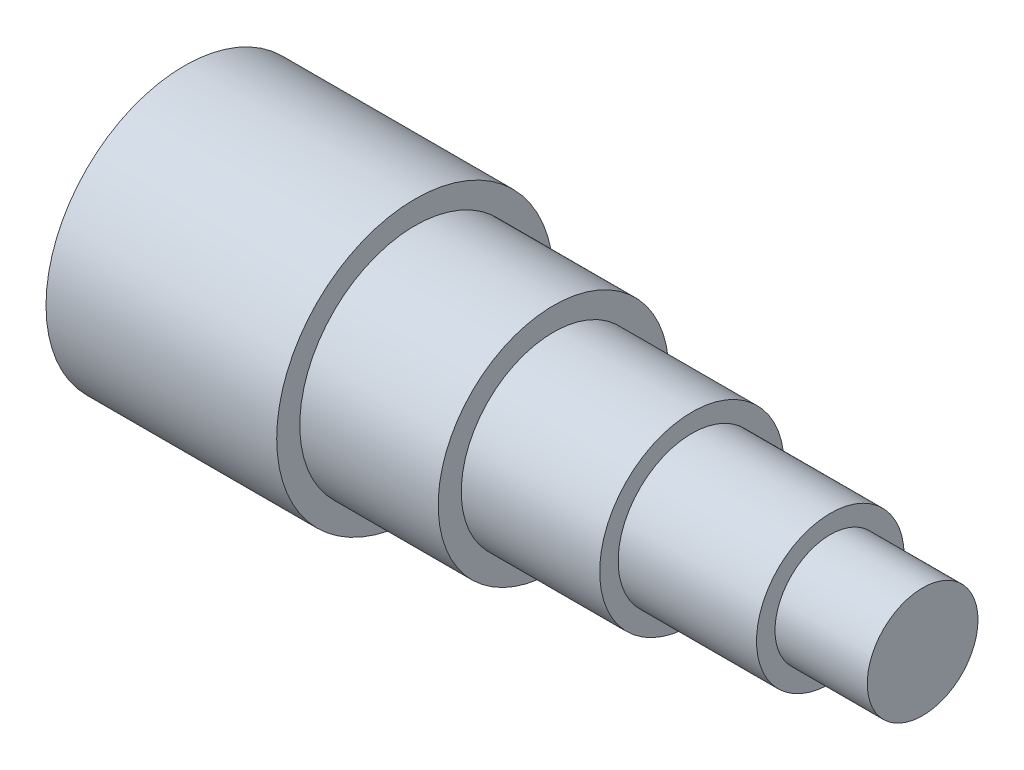
ISO-10303-21;
HEADER;
FILE_DESCRIPTION(('STEP AP214'),'2;1');
FILE_NAME('part.step','',(''),(''),'','','');
FILE_SCHEMA(('AUTOMOTIVE_DESIGN { 1 0 10303 214 1 1 1 1 }'));
ENDSEC;
DATA;
#1=APPLICATION_CONTEXT('core data for automotive mechanical design processes');
#2=APPLICATION_PROTOCOL_DEFINITION('international standard','automotive_design',2000,#1);
#3=PRODUCT_CONTEXT('',#1,'mechanical');
#4=PRODUCT('Part','Part','',(#3));
#5=PRODUCT_RELATED_PRODUCT_CATEGORY('part','',(#4));
#6=PRODUCT_DEFINITION_FORMATION('','',#4);
#7=PRODUCT_DEFINITION_CONTEXT('part definition',#1,'design');
#8=PRODUCT_DEFINITION('design','',#6,#7);
#9=PRODUCT_DEFINITION_SHAPE('','',#8);
#10=(LENGTH_UNIT() NAMED_UNIT(*) SI_UNIT(.MILLI.,.METRE.));
#11=(NAMED_UNIT(*) PLANE_ANGLE_UNIT() SI_UNIT($,.RADIAN.));
#12=(NAMED_UNIT(*) SI_UNIT($,.STERADIAN.) SOLID_ANGLE_UNIT());
#13=UNCERTAINTY_MEASURE_WITH_UNIT(LENGTH_MEASURE(1.E-05),#10,'distance_accuracy_value','');
#14=(GEOMETRIC_REPRESENTATION_CONTEXT(3) GLOBAL_UNCERTAINTY_ASSIGNED_CONTEXT((#13)) GLOBAL_UNIT_ASSIGNED_CONTEXT((#10,
#11,#12)) REPRESENTATION_CONTEXT('',''));
#15=CARTESIAN_POINT('',(0.,0.,0.));
#16=DIRECTION('',(0.,0.,1.));
#17=DIRECTION('',(1.,0.,0.));
#18=AXIS2_PLACEMENT_3D('',#15,#16,#17);
#19=CARTESIAN_POINT('',(55.,0.,0.));
#20=DIRECTION('',(1.,0.,0.));
#21=DIRECTION('',(0.,0.,-1.));
#22=AXIS2_PLACEMENT_3D('',#19,#20,#21);
#23=CYLINDRICAL_SURFACE('',#22,8.);
#24=CARTESIAN_POINT('',(55.,0.,0.));
#25=DIRECTION('',(1.,0.,0.));
#26=DIRECTION('',(0.,0.,-1.));
#27=AXIS2_PLACEMENT_3D('',#24,#25,#26);
#28=CIRCLE('',#27,8.);
#29=CARTESIAN_POINT('',(55.,0.,-8.));
#30=VERTEX_POINT('',#29);
#31=EDGE_CURVE('E69',#30,#30,#28,.T.);
#32=ORIENTED_EDGE('',*,*,#31,.T.);
#33=EDGE_LOOP('',(#32));
#34=FACE_BOUND('',#33,.T.);
#35=CARTESIAN_POINT('',(70.,0.,0.));
#36=DIRECTION('',(1.,0.,0.));
#37=DIRECTION('',(0.,0.,-1.));
#38=AXIS2_PLACEMENT_3D('',#35,#36,#37);
#39=CIRCLE('',#38,8.);
#40=CARTESIAN_POINT('',(70.,0.,-8.));
#41=VERTEX_POINT('',#40);
#42=EDGE_CURVE('E73',#41,#41,#39,.T.);
#43=ORIENTED_EDGE('',*,*,#42,.F.);
#44=EDGE_LOOP('',(#43));
#45=FACE_BOUND('',#44,.T.);
#46=ADVANCED_FACE('F37',(#34,#45),#23,.T.);
#47=CARTESIAN_POINT('',(40.,0.,0.));
#48=DIRECTION('',(1.,0.,0.));
#49=DIRECTION('',(0.,0.,-1.));
#50=AXIS2_PLACEMENT_3D('',#47,#48,#49);
#51=CYLINDRICAL_SURFACE('',#50,10.);
#52=CARTESIAN_POINT('',(40.,0.,0.));
#53=DIRECTION('',(1.,0.,0.));
#54=DIRECTION('',(0.,0.,-1.));
#55=AXIS2_PLACEMENT_3D('',#52,#53,#54);
#56=CIRCLE('',#55,10.);
#57=CARTESIAN_POINT('',(40.,0.,-10.));
#58=VERTEX_POINT('',#57);
#59=EDGE_CURVE('E61',#58,#58,#56,.T.);
#60=ORIENTED_EDGE('',*,*,#59,.T.);
#61=EDGE_LOOP('',(#60));
#62=FACE_BOUND('',#61,.T.);
#63=CARTESIAN_POINT('',(55.,0.,0.));
#64=DIRECTION('',(1.,0.,0.));
#65=DIRECTION('',(0.,0.,-1.));
#66=AXIS2_PLACEMENT_3D('',#63,#64,#65);
#67=CIRCLE('',#66,10.);
#68=CARTESIAN_POINT('',(55.,0.,-10.));
#69=VERTEX_POINT('',#68);
#70=EDGE_CURVE('E65',#69,#69,#67,.T.);
#71=ORIENTED_EDGE('',*,*,#70,.F.);
#72=EDGE_LOOP('',(#71));
#73=FACE_BOUND('',#72,.T.);
#74=ADVANCED_FACE('F97',(#62,#73),#51,.T.);
#75=CARTESIAN_POINT('',(25.,0.,0.));
#76=DIRECTION('',(1.,0.,0.));
#77=DIRECTION('',(0.,0.,-1.));
#78=AXIS2_PLACEMENT_3D('',#75,#76,#77);
#79=CYLINDRICAL_SURFACE('',#78,12.5);
#80=CARTESIAN_POINT('',(25.,0.,0.));
#81=DIRECTION('',(1.,0.,0.));
#82=DIRECTION('',(0.,0.,-1.));
#83=AXIS2_PLACEMENT_3D('',#80,#81,#82);
#84=CIRCLE('',#83,12.5);
#85=CARTESIAN_POINT('',(25.,0.,-12.5));
#86=VERTEX_POINT('',#85);
#87=EDGE_CURVE('E50',#86,#86,#84,.T.);
#88=ORIENTED_EDGE('',*,*,#87,.T.);
#89=EDGE_LOOP('',(#88));
#90=FACE_BOUND('',#89,.T.);
#91=CARTESIAN_POINT('',(40.,0.,0.));
#92=DIRECTION('',(1.,0.,0.));
#93=DIRECTION('',(0.,0.,-1.));
#94=AXIS2_PLACEMENT_3D('',#91,#92,#93);
#95=CIRCLE('',#94,12.5);
#96=CARTESIAN_POINT('',(40.,0.,-12.5));
#97=VERTEX_POINT('',#96);
#98=EDGE_CURVE('E55',#97,#97,#95,.T.);
#99=ORIENTED_EDGE('',*,*,#98,.F.);
#100=EDGE_LOOP('',(#99));
#101=FACE_BOUND('',#100,.T.);
#102=ADVANCED_FACE('F103',(#90,#101),#79,.T.);
#103=CARTESIAN_POINT('',(80.,0.,0.));
#104=DIRECTION('',(-1.,0.,0.));
#105=DIRECTION('',(0.,0.,1.));
#106=AXIS2_PLACEMENT_3D('',#103,#104,#105);
#107=CYLINDRICAL_SURFACE('',#106,15.);
#108=CARTESIAN_POINT('',(0.,0.,0.));
#109=DIRECTION('',(1.,0.,0.));
#110=DIRECTION('',(0.,0.,-1.));
#111=AXIS2_PLACEMENT_3D('',#108,#109,#110);
#112=CIRCLE('',#111,15.);
#113=CARTESIAN_POINT('',(0.,0.,-15.));
#114=VERTEX_POINT('',#113);
#115=EDGE_CURVE('E10',#114,#114,#112,.T.);
#116=ORIENTED_EDGE('',*,*,#115,.T.);
#117=EDGE_LOOP('',(#116));
#118=FACE_BOUND('',#117,.T.);
#119=CARTESIAN_POINT('',(25.,0.,0.));
#120=DIRECTION('',(1.,0.,0.));
#121=DIRECTION('',(0.,0.,-1.));
#122=AXIS2_PLACEMENT_3D('',#119,#120,#121);
#123=CIRCLE('',#122,15.);
#124=CARTESIAN_POINT('',(25.,0.,-15.));
#125=VERTEX_POINT('',#124);
#126=EDGE_CURVE('E45',#125,#125,#123,.T.);
#127=ORIENTED_EDGE('',*,*,#126,.F.);
#128=EDGE_LOOP('',(#127));
#129=FACE_BOUND('',#128,.T.);
#130=ADVANCED_FACE('F39',(#118,#129),#107,.T.);
#131=CARTESIAN_POINT('',(0.,0.,0.));
#132=DIRECTION('',(1.,0.,0.));
#133=DIRECTION('',(0.,0.,-1.));
#134=AXIS2_PLACEMENT_3D('',#131,#132,#133);
#135=PLANE('',#134);
#136=ORIENTED_EDGE('',*,*,#115,.F.);
#137=EDGE_LOOP('',(#136));
#138=FACE_BOUND('',#137,.T.);
#139=ADVANCED_FACE('F121',(#138),#135,.F.);
#140=CARTESIAN_POINT('',(25.,0.,0.));
#141=DIRECTION('',(1.,0.,0.));
#142=DIRECTION('',(0.,0.,-1.));
#143=AXIS2_PLACEMENT_3D('',#140,#141,#142);
#144=PLANE('',#143);
#145=ORIENTED_EDGE('',*,*,#87,.F.);
#146=EDGE_LOOP('',(#145));
#147=FACE_BOUND('',#146,.T.);
#148=ORIENTED_EDGE('',*,*,#126,.T.);
#149=EDGE_LOOP('',(#148));
#150=FACE_BOUND('',#149,.T.);
#151=ADVANCED_FACE('F114',(#147,#150),#144,.T.);
#152=CARTESIAN_POINT('',(40.,0.,0.));
#153=DIRECTION('',(1.,0.,0.));
#154=DIRECTION('',(0.,0.,-1.));
#155=AXIS2_PLACEMENT_3D('',#152,#153,#154);
#156=PLANE('',#155);
#157=ORIENTED_EDGE('',*,*,#59,.F.);
#158=EDGE_LOOP('',(#157));
#159=FACE_BOUND('',#158,.T.);
#160=ORIENTED_EDGE('',*,*,#98,.T.);
#161=EDGE_LOOP('',(#160));
#162=FACE_BOUND('',#161,.T.);
#163=ADVANCED_FACE('F109',(#159,#162),#156,.T.);
#164=CARTESIAN_POINT('',(55.,0.,0.));
#165=DIRECTION('',(1.,0.,0.));
#166=DIRECTION('',(0.,0.,-1.));
#167=AXIS2_PLACEMENT_3D('',#164,#165,#166);
#168=PLANE('',#167);
#169=ORIENTED_EDGE('',*,*,#31,.F.);
#170=EDGE_LOOP('',(#169));
#171=FACE_BOUND('',#170,.T.);
#172=ORIENTED_EDGE('',*,*,#70,.T.);
#173=EDGE_LOOP('',(#172));
#174=FACE_BOUND('',#173,.T.);
#175=ADVANCED_FACE('F92',(#171,#174),#168,.T.);
#176=CARTESIAN_POINT('',(70.,0.,0.));
#177=DIRECTION('',(1.,0.,0.));
#178=DIRECTION('',(0.,0.,-1.));
#179=AXIS2_PLACEMENT_3D('',#176,#177,#178);
#180=PLANE('',#179);
#181=CARTESIAN_POINT('',(70.,0.,0.));
#182=DIRECTION('',(1.,0.,0.));
#183=DIRECTION('',(0.,0.,-1.));
#184=AXIS2_PLACEMENT_3D('',#181,#182,#183);
#185=CIRCLE('',#184,6.);
#186=CARTESIAN_POINT('',(70.,0.,-6.));
#187=VERTEX_POINT('',#186);
#188=EDGE_CURVE('E77',#187,#187,#185,.T.);
#189=ORIENTED_EDGE('',*,*,#188,.F.);
#190=EDGE_LOOP('',(#189));
#191=FACE_BOUND('',#190,.T.);
#192=ORIENTED_EDGE('',*,*,#42,.T.);
#193=EDGE_LOOP('',(#192));
#194=FACE_BOUND('',#193,.T.);
#195=ADVANCED_FACE('F89',(#191,#194),#180,.T.);
#196=CARTESIAN_POINT('',(70.,0.,0.));
#197=DIRECTION('',(1.,0.,0.));
#198=DIRECTION('',(0.,0.,-1.));
#199=AXIS2_PLACEMENT_3D('',#196,#197,#198);
#200=CYLINDRICAL_SURFACE('',#199,6.);
#201=ORIENTED_EDGE('',*,*,#188,.T.);
#202=EDGE_LOOP('',(#201));
#203=FACE_BOUND('',#202,.T.);
#204=CARTESIAN_POINT('',(80.,0.,0.));
#205=DIRECTION('',(1.,0.,0.));
#206=DIRECTION('',(0.,0.,-1.));
#207=AXIS2_PLACEMENT_3D('',#204,#205,#206);
#208=CIRCLE('',#207,6.);
#209=CARTESIAN_POINT('',(80.,0.,-6.));
#210=VERTEX_POINT('',#209);
#211=EDGE_CURVE('E78',#210,#210,#208,.T.);
#212=ORIENTED_EDGE('',*,*,#211,.F.);
#213=EDGE_LOOP('',(#212));
#214=FACE_BOUND('',#213,.T.);
#215=ADVANCED_FACE('F86',(#203,#214),#200,.T.);
#216=CARTESIAN_POINT('',(80.,0.,0.));
#217=DIRECTION('',(1.,0.,0.));
#218=DIRECTION('',(0.,0.,-1.));
#219=AXIS2_PLACEMENT_3D('',#216,#217,#218);
#220=PLANE('',#219);
#221=ORIENTED_EDGE('',*,*,#211,.T.);
#222=EDGE_LOOP('',(#221));
#223=FACE_BOUND('',#222,.T.);
#224=ADVANCED_FACE('F123',(#223),#220,.T.);
#225=CLOSED_SHELL('',(#46,#74,#102,#130,#139,#151,#163,#175,#195,#215,#224));
#226=MANIFOLD_SOLID_BREP('B2',#225);
#227=ADVANCED_BREP_SHAPE_REPRESENTATION('',(#18,#226),#14);
#228=SHAPE_DEFINITION_REPRESENTATION(#9,#227);
ENDSEC;
END-ISO-10303-21;
